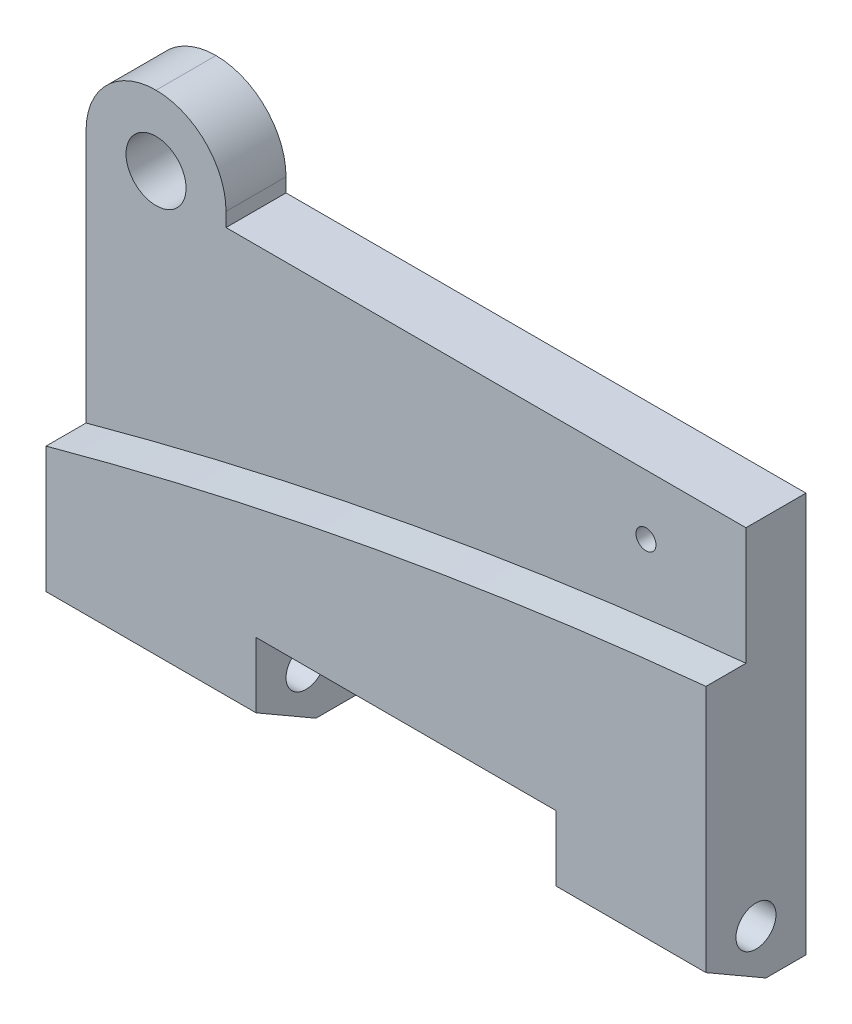
ISO-10303-21;
HEADER;
FILE_DESCRIPTION(('STEP AP214'),'2;1');
FILE_NAME('part.step','',(''),(''),'','','');
FILE_SCHEMA(('AUTOMOTIVE_DESIGN { 1 0 10303 214 1 1 1 1 }'));
ENDSEC;
DATA;
#1=APPLICATION_CONTEXT('core data for automotive mechanical design processes');
#2=APPLICATION_PROTOCOL_DEFINITION('international standard','automotive_design',2000,#1);
#3=PRODUCT_CONTEXT('',#1,'mechanical');
#4=PRODUCT('Part','Part','',(#3));
#5=PRODUCT_RELATED_PRODUCT_CATEGORY('part','',(#4));
#6=PRODUCT_DEFINITION_FORMATION('','',#4);
#7=PRODUCT_DEFINITION_CONTEXT('part definition',#1,'design');
#8=PRODUCT_DEFINITION('design','',#6,#7);
#9=PRODUCT_DEFINITION_SHAPE('','',#8);
#10=(LENGTH_UNIT() NAMED_UNIT(*) SI_UNIT(.MILLI.,.METRE.));
#11=(NAMED_UNIT(*) PLANE_ANGLE_UNIT() SI_UNIT($,.RADIAN.));
#12=(NAMED_UNIT(*) SI_UNIT($,.STERADIAN.) SOLID_ANGLE_UNIT());
#13=UNCERTAINTY_MEASURE_WITH_UNIT(LENGTH_MEASURE(1.E-05),#10,'distance_accuracy_value','');
#14=(GEOMETRIC_REPRESENTATION_CONTEXT(3) GLOBAL_UNCERTAINTY_ASSIGNED_CONTEXT((#13)) GLOBAL_UNIT_ASSIGNED_CONTEXT((#10,
#11,#12)) REPRESENTATION_CONTEXT('',''));
#15=CARTESIAN_POINT('',(0.,0.,0.));
#16=DIRECTION('',(0.,0.,1.));
#17=DIRECTION('',(1.,0.,0.));
#18=AXIS2_PLACEMENT_3D('',#15,#16,#17);
#19=CARTESIAN_POINT('',(-16.5,10.,5.));
#20=DIRECTION('',(0.,-1.,0.));
#21=DIRECTION('',(0.,0.,-1.));
#22=AXIS2_PLACEMENT_3D('',#19,#20,#21);
#23=PLANE('',#22);
#24=DIRECTION('',(0.,0.,-1.));
#25=VECTOR('',#24,1.);
#26=CARTESIAN_POINT('',(-9.5,10.,3.));
#27=LINE('',#26,#25);
#28=CARTESIAN_POINT('',(-9.5,10.,3.));
#29=VERTEX_POINT('',#28);
#30=CARTESIAN_POINT('',(-9.5,10.,0.));
#31=VERTEX_POINT('',#30);
#32=EDGE_CURVE('E152',#29,#31,#27,.T.);
#33=ORIENTED_EDGE('',*,*,#32,.F.);
#34=DIRECTION('',(-1.,0.,0.));
#35=VECTOR('',#34,1.);
#36=CARTESIAN_POINT('',(0.,10.,3.));
#37=LINE('',#36,#35);
#38=CARTESIAN_POINT('',(16.5,10.,3.));
#39=VERTEX_POINT('',#38);
#40=EDGE_CURVE('E189',#39,#29,#37,.T.);
#41=ORIENTED_EDGE('',*,*,#40,.F.);
#42=DIRECTION('',(0.,0.,-1.));
#43=VECTOR('',#42,1.);
#44=CARTESIAN_POINT('',(16.5,10.,5.));
#45=LINE('',#44,#43);
#46=CARTESIAN_POINT('',(16.5,10.,0.));
#47=VERTEX_POINT('',#46);
#48=EDGE_CURVE('E159',#39,#47,#45,.T.);
#49=ORIENTED_EDGE('',*,*,#48,.T.);
#50=DIRECTION('',(-1.,0.,0.));
#51=VECTOR('',#50,1.);
#52=CARTESIAN_POINT('',(-16.5,10.,0.));
#53=LINE('',#52,#51);
#54=EDGE_CURVE('E143',#47,#31,#53,.T.);
#55=ORIENTED_EDGE('',*,*,#54,.T.);
#56=EDGE_LOOP('',(#33,#41,#49,#55));
#57=FACE_BOUND('',#56,.T.);
#58=ADVANCED_FACE('F34',(#57),#23,.F.);
#59=CARTESIAN_POINT('',(16.5,-10.,5.));
#60=DIRECTION('',(-1.,0.,0.));
#61=DIRECTION('',(0.,0.,1.));
#62=AXIS2_PLACEMENT_3D('',#59,#60,#61);
#63=PLANE('',#62);
#64=CARTESIAN_POINT('',(16.5,-7.5,2.5));
#65=DIRECTION('',(1.,0.,0.));
#66=DIRECTION('',(0.,0.,-1.));
#67=AXIS2_PLACEMENT_3D('',#64,#65,#66);
#68=CIRCLE('',#67,1.);
#69=CARTESIAN_POINT('',(16.5,-7.5,1.5));
#70=VERTEX_POINT('',#69);
#71=EDGE_CURVE('E249',#70,#70,#68,.T.);
#72=ORIENTED_EDGE('',*,*,#71,.F.);
#73=EDGE_LOOP('',(#72));
#74=FACE_BOUND('',#73,.T.);
#75=DIRECTION('',(0.,1.,0.));
#76=VECTOR('',#75,1.);
#77=CARTESIAN_POINT('',(16.5,-10.,5.));
#78=LINE('',#77,#76);
#79=CARTESIAN_POINT('',(16.5,-8.26794919243112,5.));
#80=VERTEX_POINT('',#79);
#81=CARTESIAN_POINT('',(16.5,4.12898479637031,5.));
#82=VERTEX_POINT('',#81);
#83=EDGE_CURVE('E222',#80,#82,#78,.T.);
#84=ORIENTED_EDGE('',*,*,#83,.F.);
#85=DIRECTION('',(0.,0.499999999999997,0.86602540378444));
#86=VECTOR('',#85,1.);
#87=CARTESIAN_POINT('',(16.5,-8.26794919243112,5.));
#88=LINE('',#87,#86);
#89=CARTESIAN_POINT('',(16.5,-10.,1.99999999999998));
#90=VERTEX_POINT('',#89);
#91=EDGE_CURVE('E56',#80,#90,#88,.F.);
#92=ORIENTED_EDGE('',*,*,#91,.T.);
#93=DIRECTION('',(0.,0.,-1.));
#94=VECTOR('',#93,1.);
#95=CARTESIAN_POINT('',(16.5,-10.,5.));
#96=LINE('',#95,#94);
#97=CARTESIAN_POINT('',(16.5,-10.,0.));
#98=VERTEX_POINT('',#97);
#99=EDGE_CURVE('E216',#90,#98,#96,.T.);
#100=ORIENTED_EDGE('',*,*,#99,.T.);
#101=DIRECTION('',(0.,1.,0.));
#102=VECTOR('',#101,1.);
#103=CARTESIAN_POINT('',(16.5,-10.,0.));
#104=LINE('',#103,#102);
#105=EDGE_CURVE('E161',#98,#47,#104,.T.);
#106=ORIENTED_EDGE('',*,*,#105,.T.);
#107=ORIENTED_EDGE('',*,*,#48,.F.);
#108=DIRECTION('',(0.,1.,0.));
#109=VECTOR('',#108,1.);
#110=CARTESIAN_POINT('',(16.5,0.,3.));
#111=LINE('',#110,#109);
#112=CARTESIAN_POINT('',(16.5,4.12898479637031,3.));
#113=VERTEX_POINT('',#112);
#114=EDGE_CURVE('E186',#113,#39,#111,.T.);
#115=ORIENTED_EDGE('',*,*,#114,.F.);
#116=DIRECTION('',(0.,0.,1.));
#117=VECTOR('',#116,1.);
#118=CARTESIAN_POINT('',(16.5,4.12898479637031,3.));
#119=LINE('',#118,#117);
#120=EDGE_CURVE('E255',#113,#82,#119,.T.);
#121=ORIENTED_EDGE('',*,*,#120,.T.);
#122=EDGE_LOOP('',(#84,#92,#100,#106,#107,#115,#121));
#123=FACE_BOUND('',#122,.T.);
#124=ADVANCED_FACE('F315',(#74,#123),#63,.F.);
#125=CARTESIAN_POINT('',(-16.5,-10.,5.));
#126=DIRECTION('',(1.,0.,0.));
#127=DIRECTION('',(0.,0.,-1.));
#128=AXIS2_PLACEMENT_3D('',#125,#126,#127);
#129=PLANE('',#128);
#130=CARTESIAN_POINT('',(-16.5,-7.5,2.5));
#131=DIRECTION('',(1.,0.,0.));
#132=DIRECTION('',(0.,0.,-1.));
#133=AXIS2_PLACEMENT_3D('',#130,#131,#132);
#134=CIRCLE('',#133,1.);
#135=CARTESIAN_POINT('',(-16.5,-7.5,1.5));
#136=VERTEX_POINT('',#135);
#137=EDGE_CURVE('E201',#136,#136,#134,.T.);
#138=ORIENTED_EDGE('',*,*,#137,.T.);
#139=EDGE_LOOP('',(#138));
#140=FACE_BOUND('',#139,.T.);
#141=DIRECTION('',(0.,0.,-1.));
#142=VECTOR('',#141,1.);
#143=CARTESIAN_POINT('',(-16.5,-10.,5.));
#144=LINE('',#143,#142);
#145=CARTESIAN_POINT('',(-16.5,-10.,1.99999999999998));
#146=VERTEX_POINT('',#145);
#147=CARTESIAN_POINT('',(-16.5,-10.,0.));
#148=VERTEX_POINT('',#147);
#149=EDGE_CURVE('E204',#146,#148,#144,.T.);
#150=ORIENTED_EDGE('',*,*,#149,.F.);
#151=DIRECTION('',(0.,-0.499999999999997,-0.86602540378444));
#152=VECTOR('',#151,1.);
#153=CARTESIAN_POINT('',(-16.5,-8.26794919243112,5.));
#154=LINE('',#153,#152);
#155=CARTESIAN_POINT('',(-16.5,-8.26794919243112,5.));
#156=VERTEX_POINT('',#155);
#157=EDGE_CURVE('E273',#146,#156,#154,.F.);
#158=ORIENTED_EDGE('',*,*,#157,.T.);
#159=DIRECTION('',(0.,-1.,0.));
#160=VECTOR('',#159,1.);
#161=CARTESIAN_POINT('',(-16.5,-10.,5.));
#162=LINE('',#161,#160);
#163=CARTESIAN_POINT('',(-16.5,-1.96376903374117,5.));
#164=VERTEX_POINT('',#163);
#165=EDGE_CURVE('E243',#164,#156,#162,.T.);
#166=ORIENTED_EDGE('',*,*,#165,.F.);
#167=DIRECTION('',(0.,0.,1.));
#168=VECTOR('',#167,1.);
#169=CARTESIAN_POINT('',(-16.5,-1.96376903374117,3.));
#170=LINE('',#169,#168);
#171=CARTESIAN_POINT('',(-16.5,-1.96376903374117,3.));
#172=VERTEX_POINT('',#171);
#173=EDGE_CURVE('E252',#172,#164,#170,.T.);
#174=ORIENTED_EDGE('',*,*,#173,.F.);
#175=DIRECTION('',(0.,-1.,0.));
#176=VECTOR('',#175,1.);
#177=CARTESIAN_POINT('',(-16.5,0.,3.));
#178=LINE('',#177,#176);
#179=CARTESIAN_POINT('',(-16.5,10.7,3.));
#180=VERTEX_POINT('',#179);
#181=EDGE_CURVE('E192',#180,#172,#178,.T.);
#182=ORIENTED_EDGE('',*,*,#181,.F.);
#183=DIRECTION('',(0.,0.,1.));
#184=VECTOR('',#183,1.);
#185=CARTESIAN_POINT('',(-16.5,10.7,5.));
#186=LINE('',#185,#184);
#187=CARTESIAN_POINT('',(-16.5,10.7,0.));
#188=VERTEX_POINT('',#187);
#189=EDGE_CURVE('E287',#180,#188,#186,.F.);
#190=ORIENTED_EDGE('',*,*,#189,.T.);
#191=DIRECTION('',(0.,-1.,0.));
#192=VECTOR('',#191,1.);
#193=CARTESIAN_POINT('',(-16.5,-10.,0.));
#194=LINE('',#193,#192);
#195=EDGE_CURVE('E160',#188,#148,#194,.T.);
#196=ORIENTED_EDGE('',*,*,#195,.T.);
#197=EDGE_LOOP('',(#150,#158,#166,#174,#182,#190,#196));
#198=FACE_BOUND('',#197,.T.);
#199=ADVANCED_FACE('F270',(#140,#198),#129,.F.);
#200=CARTESIAN_POINT('',(0.,0.,5.));
#201=DIRECTION('',(0.,0.,-1.));
#202=DIRECTION('',(-1.,0.,0.));
#203=AXIS2_PLACEMENT_3D('',#200,#201,#202);
#204=PLANE('',#203);
#205=ORIENTED_EDGE('',*,*,#165,.T.);
#206=DIRECTION('',(1.,0.,0.));
#207=VECTOR('',#206,1.);
#208=CARTESIAN_POINT('',(0.,-8.26794919243112,5.));
#209=LINE('',#208,#207);
#210=CARTESIAN_POINT('',(-6.,-8.26794919243112,5.));
#211=VERTEX_POINT('',#210);
#212=EDGE_CURVE('E283',#156,#211,#209,.T.);
#213=ORIENTED_EDGE('',*,*,#212,.T.);
#214=DIRECTION('',(0.,1.,0.));
#215=VECTOR('',#214,1.);
#216=CARTESIAN_POINT('',(-6.,-10.,5.));
#217=LINE('',#216,#215);
#218=CARTESIAN_POINT('',(-6.,-5.,5.));
#219=VERTEX_POINT('',#218);
#220=EDGE_CURVE('E241',#211,#219,#217,.T.);
#221=ORIENTED_EDGE('',*,*,#220,.T.);
#222=DIRECTION('',(1.,0.,0.));
#223=VECTOR('',#222,1.);
#224=CARTESIAN_POINT('',(-6.,-5.,5.));
#225=LINE('',#224,#223);
#226=CARTESIAN_POINT('',(9.,-5.,5.));
#227=VERTEX_POINT('',#226);
#228=EDGE_CURVE('E239',#219,#227,#225,.T.);
#229=ORIENTED_EDGE('',*,*,#228,.T.);
#230=DIRECTION('',(0.,-1.,0.));
#231=VECTOR('',#230,1.);
#232=CARTESIAN_POINT('',(9.,-10.,5.));
#233=LINE('',#232,#231);
#234=CARTESIAN_POINT('',(9.,-8.26794919243112,5.));
#235=VERTEX_POINT('',#234);
#236=EDGE_CURVE('E218',#227,#235,#233,.T.);
#237=ORIENTED_EDGE('',*,*,#236,.T.);
#238=DIRECTION('',(1.,0.,0.));
#239=VECTOR('',#238,1.);
#240=CARTESIAN_POINT('',(0.,-8.26794919243112,5.));
#241=LINE('',#240,#239);
#242=EDGE_CURVE('E285',#235,#80,#241,.T.);
#243=ORIENTED_EDGE('',*,*,#242,.T.);
#244=ORIENTED_EDGE('',*,*,#83,.T.);
#245=CARTESIAN_POINT('',(35.7914299403676,-192.7734416106,5.));
#246=DIRECTION('',(0.,0.,1.));
#247=DIRECTION('',(1.,0.,0.));
#248=AXIS2_PLACEMENT_3D('',#245,#246,#247);
#249=CIRCLE('',#248,197.845204122052);
#250=EDGE_CURVE('E187',#82,#164,#249,.T.);
#251=ORIENTED_EDGE('',*,*,#250,.T.);
#252=EDGE_LOOP('',(#205,#213,#221,#229,#237,#243,#244,#251));
#253=FACE_BOUND('',#252,.T.);
#254=ADVANCED_FACE('F262',(#253),#204,.F.);
#255=CARTESIAN_POINT('',(-16.5,-10.,5.));
#256=DIRECTION('',(0.,1.,0.));
#257=DIRECTION('',(0.,0.,1.));
#258=AXIS2_PLACEMENT_3D('',#255,#256,#257);
#259=PLANE('',#258);
#260=DIRECTION('',(0.,0.,-1.));
#261=VECTOR('',#260,1.);
#262=CARTESIAN_POINT('',(-6.,-10.,5.));
#263=LINE('',#262,#261);
#264=CARTESIAN_POINT('',(-6.,-10.,1.99999999999998));
#265=VERTEX_POINT('',#264);
#266=CARTESIAN_POINT('',(-6.,-10.,0.));
#267=VERTEX_POINT('',#266);
#268=EDGE_CURVE('E206',#265,#267,#263,.T.);
#269=ORIENTED_EDGE('',*,*,#268,.F.);
#270=DIRECTION('',(-1.,0.,0.));
#271=VECTOR('',#270,1.);
#272=CARTESIAN_POINT('',(-16.5,-10.,1.99999999999998));
#273=LINE('',#272,#271);
#274=EDGE_CURVE('E276',#265,#146,#273,.T.);
#275=ORIENTED_EDGE('',*,*,#274,.T.);
#276=ORIENTED_EDGE('',*,*,#149,.T.);
#277=DIRECTION('',(1.,0.,0.));
#278=VECTOR('',#277,1.);
#279=CARTESIAN_POINT('',(-16.5,-10.,0.));
#280=LINE('',#279,#278);
#281=EDGE_CURVE('E230',#148,#267,#280,.T.);
#282=ORIENTED_EDGE('',*,*,#281,.T.);
#283=EDGE_LOOP('',(#269,#275,#276,#282));
#284=FACE_BOUND('',#283,.T.);
#285=ADVANCED_FACE('F335',(#284),#259,.F.);
#286=CARTESIAN_POINT('',(-6.,-10.,5.));
#287=DIRECTION('',(-1.,0.,0.));
#288=DIRECTION('',(0.,0.,1.));
#289=AXIS2_PLACEMENT_3D('',#286,#287,#288);
#290=PLANE('',#289);
#291=CARTESIAN_POINT('',(-6.,-7.5,2.5));
#292=DIRECTION('',(-1.,0.,0.));
#293=DIRECTION('',(0.,0.,1.));
#294=AXIS2_PLACEMENT_3D('',#291,#292,#293);
#295=CIRCLE('',#294,1.);
#296=CARTESIAN_POINT('',(-6.,-7.5,3.5));
#297=VERTEX_POINT('',#296);
#298=EDGE_CURVE('E200',#297,#297,#295,.T.);
#299=ORIENTED_EDGE('',*,*,#298,.T.);
#300=EDGE_LOOP('',(#299));
#301=FACE_BOUND('',#300,.T.);
#302=ORIENTED_EDGE('',*,*,#220,.F.);
#303=DIRECTION('',(0.,0.499999999999997,0.86602540378444));
#304=VECTOR('',#303,1.);
#305=CARTESIAN_POINT('',(-6.,-8.26794919243112,5.));
#306=LINE('',#305,#304);
#307=EDGE_CURVE('E279',#211,#265,#306,.F.);
#308=ORIENTED_EDGE('',*,*,#307,.T.);
#309=ORIENTED_EDGE('',*,*,#268,.T.);
#310=DIRECTION('',(0.,1.,0.));
#311=VECTOR('',#310,1.);
#312=CARTESIAN_POINT('',(-6.,-10.,0.));
#313=LINE('',#312,#311);
#314=CARTESIAN_POINT('',(-6.,-5.,0.));
#315=VERTEX_POINT('',#314);
#316=EDGE_CURVE('E228',#267,#315,#313,.T.);
#317=ORIENTED_EDGE('',*,*,#316,.T.);
#318=DIRECTION('',(0.,0.,-1.));
#319=VECTOR('',#318,1.);
#320=CARTESIAN_POINT('',(-6.,-5.,5.));
#321=LINE('',#320,#319);
#322=EDGE_CURVE('E208',#219,#315,#321,.T.);
#323=ORIENTED_EDGE('',*,*,#322,.F.);
#324=EDGE_LOOP('',(#302,#308,#309,#317,#323));
#325=FACE_BOUND('',#324,.T.);
#326=ADVANCED_FACE('F332',(#301,#325),#290,.F.);
#327=CARTESIAN_POINT('',(-6.,-5.,5.));
#328=DIRECTION('',(0.,1.,0.));
#329=DIRECTION('',(0.,0.,1.));
#330=AXIS2_PLACEMENT_3D('',#327,#328,#329);
#331=PLANE('',#330);
#332=DIRECTION('',(1.,0.,0.));
#333=VECTOR('',#332,1.);
#334=CARTESIAN_POINT('',(-6.,-5.,0.));
#335=LINE('',#334,#333);
#336=CARTESIAN_POINT('',(9.,-5.,0.));
#337=VERTEX_POINT('',#336);
#338=EDGE_CURVE('E226',#315,#337,#335,.T.);
#339=ORIENTED_EDGE('',*,*,#338,.T.);
#340=DIRECTION('',(0.,0.,-1.));
#341=VECTOR('',#340,1.);
#342=CARTESIAN_POINT('',(9.,-5.,5.));
#343=LINE('',#342,#341);
#344=EDGE_CURVE('E211',#227,#337,#343,.T.);
#345=ORIENTED_EDGE('',*,*,#344,.F.);
#346=ORIENTED_EDGE('',*,*,#228,.F.);
#347=ORIENTED_EDGE('',*,*,#322,.T.);
#348=EDGE_LOOP('',(#339,#345,#346,#347));
#349=FACE_BOUND('',#348,.T.);
#350=ADVANCED_FACE('F327',(#349),#331,.F.);
#351=CARTESIAN_POINT('',(9.,-10.,5.));
#352=DIRECTION('',(1.,0.,0.));
#353=DIRECTION('',(0.,0.,-1.));
#354=AXIS2_PLACEMENT_3D('',#351,#352,#353);
#355=PLANE('',#354);
#356=CARTESIAN_POINT('',(9.,-7.5,2.5));
#357=DIRECTION('',(1.,0.,0.));
#358=DIRECTION('',(0.,0.,-1.));
#359=AXIS2_PLACEMENT_3D('',#356,#357,#358);
#360=CIRCLE('',#359,1.);
#361=CARTESIAN_POINT('',(9.,-7.5,1.5));
#362=VERTEX_POINT('',#361);
#363=EDGE_CURVE('E197',#362,#362,#360,.T.);
#364=ORIENTED_EDGE('',*,*,#363,.T.);
#365=EDGE_LOOP('',(#364));
#366=FACE_BOUND('',#365,.T.);
#367=DIRECTION('',(0.,0.,-1.));
#368=VECTOR('',#367,1.);
#369=CARTESIAN_POINT('',(9.,-10.,5.));
#370=LINE('',#369,#368);
#371=CARTESIAN_POINT('',(9.,-10.,1.99999999999998));
#372=VERTEX_POINT('',#371);
#373=CARTESIAN_POINT('',(9.,-10.,0.));
#374=VERTEX_POINT('',#373);
#375=EDGE_CURVE('E214',#372,#374,#370,.T.);
#376=ORIENTED_EDGE('',*,*,#375,.F.);
#377=DIRECTION('',(0.,-0.499999999999997,-0.86602540378444));
#378=VECTOR('',#377,1.);
#379=CARTESIAN_POINT('',(9.,-8.26794919243112,5.));
#380=LINE('',#379,#378);
#381=EDGE_CURVE('E12',#372,#235,#380,.F.);
#382=ORIENTED_EDGE('',*,*,#381,.T.);
#383=ORIENTED_EDGE('',*,*,#236,.F.);
#384=ORIENTED_EDGE('',*,*,#344,.T.);
#385=DIRECTION('',(0.,-1.,0.));
#386=VECTOR('',#385,1.);
#387=CARTESIAN_POINT('',(9.,-10.,0.));
#388=LINE('',#387,#386);
#389=EDGE_CURVE('E223',#337,#374,#388,.T.);
#390=ORIENTED_EDGE('',*,*,#389,.T.);
#391=EDGE_LOOP('',(#376,#382,#383,#384,#390));
#392=FACE_BOUND('',#391,.T.);
#393=ADVANCED_FACE('F322',(#366,#392),#355,.F.);
#394=CARTESIAN_POINT('',(9.,-10.,5.));
#395=DIRECTION('',(0.,1.,0.));
#396=DIRECTION('',(0.,0.,1.));
#397=AXIS2_PLACEMENT_3D('',#394,#395,#396);
#398=PLANE('',#397);
#399=ORIENTED_EDGE('',*,*,#99,.F.);
#400=DIRECTION('',(-1.,0.,0.));
#401=VECTOR('',#400,1.);
#402=CARTESIAN_POINT('',(9.,-10.,1.99999999999998));
#403=LINE('',#402,#401);
#404=EDGE_CURVE('E42',#90,#372,#403,.T.);
#405=ORIENTED_EDGE('',*,*,#404,.T.);
#406=ORIENTED_EDGE('',*,*,#375,.T.);
#407=DIRECTION('',(1.,0.,0.));
#408=VECTOR('',#407,1.);
#409=CARTESIAN_POINT('',(9.,-10.,0.));
#410=LINE('',#409,#408);
#411=EDGE_CURVE('E219',#374,#98,#410,.T.);
#412=ORIENTED_EDGE('',*,*,#411,.T.);
#413=EDGE_LOOP('',(#399,#405,#406,#412));
#414=FACE_BOUND('',#413,.T.);
#415=ADVANCED_FACE('F319',(#414),#398,.F.);
#416=CARTESIAN_POINT('',(0.,0.,0.));
#417=DIRECTION('',(0.,0.,-1.));
#418=DIRECTION('',(-1.,0.,0.));
#419=AXIS2_PLACEMENT_3D('',#416,#417,#418);
#420=PLANE('',#419);
#421=CARTESIAN_POINT('',(-13.,10.7,0.));
#422=DIRECTION('',(0.,0.,-1.));
#423=DIRECTION('',(-1.,0.,0.));
#424=AXIS2_PLACEMENT_3D('',#421,#422,#423);
#425=CIRCLE('',#424,1.5);
#426=CARTESIAN_POINT('',(-14.5,10.7,0.));
#427=VERTEX_POINT('',#426);
#428=EDGE_CURVE('E168',#427,#427,#425,.T.);
#429=ORIENTED_EDGE('',*,*,#428,.F.);
#430=EDGE_LOOP('',(#429));
#431=FACE_BOUND('',#430,.T.);
#432=CARTESIAN_POINT('',(11.5,7.00000000000001,0.));
#433=DIRECTION('',(0.,0.,-1.));
#434=DIRECTION('',(1.,0.,0.));
#435=AXIS2_PLACEMENT_3D('',#432,#433,#434);
#436=CIRCLE('',#435,0.500000000000001);
#437=CARTESIAN_POINT('',(12.,7.00000000000001,0.));
#438=VERTEX_POINT('',#437);
#439=EDGE_CURVE('E179',#438,#438,#436,.T.);
#440=ORIENTED_EDGE('',*,*,#439,.F.);
#441=EDGE_LOOP('',(#440));
#442=FACE_BOUND('',#441,.T.);
#443=CARTESIAN_POINT('',(-13.,10.7,0.));
#444=DIRECTION('',(0.,0.,-1.));
#445=DIRECTION('',(-1.,0.,0.));
#446=AXIS2_PLACEMENT_3D('',#443,#444,#445);
#447=CIRCLE('',#446,3.5);
#448=CARTESIAN_POINT('',(-13.,14.2,0.));
#449=VERTEX_POINT('',#448);
#450=EDGE_CURVE('E203',#188,#449,#447,.T.);
#451=ORIENTED_EDGE('',*,*,#450,.T.);
#452=CARTESIAN_POINT('',(-13.,10.7,0.));
#453=DIRECTION('',(0.,0.,-1.));
#454=DIRECTION('',(-1.,0.,0.));
#455=AXIS2_PLACEMENT_3D('',#452,#453,#454);
#456=CIRCLE('',#455,3.5);
#457=CARTESIAN_POINT('',(-9.5,10.7,0.));
#458=VERTEX_POINT('',#457);
#459=EDGE_CURVE('E146',#449,#458,#456,.T.);
#460=ORIENTED_EDGE('',*,*,#459,.T.);
#461=DIRECTION('',(0.,-1.,0.));
#462=VECTOR('',#461,1.);
#463=CARTESIAN_POINT('',(-9.5,14.2,0.));
#464=LINE('',#463,#462);
#465=EDGE_CURVE('E139',#458,#31,#464,.T.);
#466=ORIENTED_EDGE('',*,*,#465,.T.);
#467=ORIENTED_EDGE('',*,*,#54,.F.);
#468=ORIENTED_EDGE('',*,*,#105,.F.);
#469=ORIENTED_EDGE('',*,*,#411,.F.);
#470=ORIENTED_EDGE('',*,*,#389,.F.);
#471=ORIENTED_EDGE('',*,*,#338,.F.);
#472=ORIENTED_EDGE('',*,*,#316,.F.);
#473=ORIENTED_EDGE('',*,*,#281,.F.);
#474=ORIENTED_EDGE('',*,*,#195,.F.);
#475=EDGE_LOOP('',(#451,#460,#466,#467,#468,#469,#470,#471,#472,#473,#474));
#476=FACE_BOUND('',#475,.T.);
#477=ADVANCED_FACE('F141',(#431,#442,#476),#420,.T.);
#478=CARTESIAN_POINT('',(-16.5,-7.5,2.5));
#479=DIRECTION('',(1.,0.,0.));
#480=DIRECTION('',(0.,0.,-1.));
#481=AXIS2_PLACEMENT_3D('',#478,#479,#480);
#482=CYLINDRICAL_SURFACE('',#481,1.);
#483=ORIENTED_EDGE('',*,*,#71,.T.);
#484=EDGE_LOOP('',(#483));
#485=FACE_BOUND('',#484,.T.);
#486=ORIENTED_EDGE('',*,*,#363,.F.);
#487=EDGE_LOOP('',(#486));
#488=FACE_BOUND('',#487,.T.);
#489=ADVANCED_FACE('F347',(#485,#488),#482,.F.);
#490=ORIENTED_EDGE('',*,*,#137,.F.);
#491=EDGE_LOOP('',(#490));
#492=FACE_BOUND('',#491,.T.);
#493=ORIENTED_EDGE('',*,*,#298,.F.);
#494=EDGE_LOOP('',(#493));
#495=FACE_BOUND('',#494,.T.);
#496=ADVANCED_FACE('F338',(#492,#495),#482,.F.);
#497=CARTESIAN_POINT('',(35.7914299403676,-192.7734416106,3.));
#498=DIRECTION('',(0.,0.,1.));
#499=DIRECTION('',(1.,0.,0.));
#500=AXIS2_PLACEMENT_3D('',#497,#498,#499);
#501=CYLINDRICAL_SURFACE('',#500,197.845204122052);
#502=ORIENTED_EDGE('',*,*,#250,.F.);
#503=ORIENTED_EDGE('',*,*,#120,.F.);
#504=CARTESIAN_POINT('',(35.7914299403676,-192.7734416106,3.));
#505=DIRECTION('',(0.,0.,1.));
#506=DIRECTION('',(1.,0.,0.));
#507=AXIS2_PLACEMENT_3D('',#504,#505,#506);
#508=CIRCLE('',#507,197.845204122052);
#509=EDGE_CURVE('E183',#113,#172,#508,.T.);
#510=ORIENTED_EDGE('',*,*,#509,.T.);
#511=ORIENTED_EDGE('',*,*,#173,.T.);
#512=EDGE_LOOP('',(#502,#503,#510,#511));
#513=FACE_BOUND('',#512,.T.);
#514=ADVANCED_FACE('F336',(#513),#501,.T.);
#515=CARTESIAN_POINT('',(0.,0.,3.));
#516=DIRECTION('',(0.,0.,1.));
#517=DIRECTION('',(1.,0.,0.));
#518=AXIS2_PLACEMENT_3D('',#515,#516,#517);
#519=PLANE('',#518);
#520=CARTESIAN_POINT('',(-13.,10.7,3.));
#521=DIRECTION('',(0.,0.,1.));
#522=DIRECTION('',(1.,0.,0.));
#523=AXIS2_PLACEMENT_3D('',#520,#521,#522);
#524=CIRCLE('',#523,1.5);
#525=CARTESIAN_POINT('',(-11.5,10.7,3.));
#526=VERTEX_POINT('',#525);
#527=EDGE_CURVE('E165',#526,#526,#524,.T.);
#528=ORIENTED_EDGE('',*,*,#527,.F.);
#529=EDGE_LOOP('',(#528));
#530=FACE_BOUND('',#529,.T.);
#531=CARTESIAN_POINT('',(11.5,7.00000000000001,3.));
#532=DIRECTION('',(0.,0.,1.));
#533=DIRECTION('',(1.,0.,0.));
#534=AXIS2_PLACEMENT_3D('',#531,#532,#533);
#535=CIRCLE('',#534,0.500000000000001);
#536=CARTESIAN_POINT('',(12.,7.00000000000001,3.));
#537=VERTEX_POINT('',#536);
#538=EDGE_CURVE('E182',#537,#537,#535,.T.);
#539=ORIENTED_EDGE('',*,*,#538,.F.);
#540=EDGE_LOOP('',(#539));
#541=FACE_BOUND('',#540,.T.);
#542=DIRECTION('',(0.,-1.,0.));
#543=VECTOR('',#542,1.);
#544=CARTESIAN_POINT('',(-9.5,14.2,3.));
#545=LINE('',#544,#543);
#546=CARTESIAN_POINT('',(-9.5,10.7,3.));
#547=VERTEX_POINT('',#546);
#548=EDGE_CURVE('E151',#547,#29,#545,.T.);
#549=ORIENTED_EDGE('',*,*,#548,.F.);
#550=CARTESIAN_POINT('',(-13.,10.7,3.));
#551=DIRECTION('',(0.,0.,1.));
#552=DIRECTION('',(1.,0.,0.));
#553=AXIS2_PLACEMENT_3D('',#550,#551,#552);
#554=CIRCLE('',#553,3.5);
#555=CARTESIAN_POINT('',(-13.,14.2,3.));
#556=VERTEX_POINT('',#555);
#557=EDGE_CURVE('E292',#547,#556,#554,.T.);
#558=ORIENTED_EDGE('',*,*,#557,.T.);
#559=CARTESIAN_POINT('',(-13.,10.7,3.));
#560=DIRECTION('',(0.,0.,1.));
#561=DIRECTION('',(1.,0.,0.));
#562=AXIS2_PLACEMENT_3D('',#559,#560,#561);
#563=CIRCLE('',#562,3.5);
#564=EDGE_CURVE('E294',#556,#180,#563,.T.);
#565=ORIENTED_EDGE('',*,*,#564,.T.);
#566=ORIENTED_EDGE('',*,*,#181,.T.);
#567=ORIENTED_EDGE('',*,*,#509,.F.);
#568=ORIENTED_EDGE('',*,*,#114,.T.);
#569=ORIENTED_EDGE('',*,*,#40,.T.);
#570=EDGE_LOOP('',(#549,#558,#565,#566,#567,#568,#569));
#571=FACE_BOUND('',#570,.T.);
#572=ADVANCED_FACE('F312',(#530,#541,#571),#519,.T.);
#573=CARTESIAN_POINT('',(11.5,7.00000000000001,5.));
#574=DIRECTION('',(0.,0.,-1.));
#575=DIRECTION('',(-1.,0.,0.));
#576=AXIS2_PLACEMENT_3D('',#573,#574,#575);
#577=CYLINDRICAL_SURFACE('',#576,0.500000000000001);
#578=ORIENTED_EDGE('',*,*,#538,.T.);
#579=EDGE_LOOP('',(#578));
#580=FACE_BOUND('',#579,.T.);
#581=ORIENTED_EDGE('',*,*,#439,.T.);
#582=EDGE_LOOP('',(#581));
#583=FACE_BOUND('',#582,.T.);
#584=ADVANCED_FACE('F344',(#580,#583),#577,.F.);
#585=CARTESIAN_POINT('',(-9.5,14.2,3.));
#586=DIRECTION('',(-1.,0.,0.));
#587=DIRECTION('',(0.,0.,1.));
#588=AXIS2_PLACEMENT_3D('',#585,#586,#587);
#589=PLANE('',#588);
#590=ORIENTED_EDGE('',*,*,#465,.F.);
#591=DIRECTION('',(0.,0.,-1.));
#592=VECTOR('',#591,1.);
#593=CARTESIAN_POINT('',(-9.5,10.7,3.));
#594=LINE('',#593,#592);
#595=EDGE_CURVE('E296',#458,#547,#594,.F.);
#596=ORIENTED_EDGE('',*,*,#595,.T.);
#597=ORIENTED_EDGE('',*,*,#548,.T.);
#598=ORIENTED_EDGE('',*,*,#32,.T.);
#599=EDGE_LOOP('',(#590,#596,#597,#598));
#600=FACE_BOUND('',#599,.T.);
#601=ADVANCED_FACE('F163',(#600),#589,.F.);
#602=CARTESIAN_POINT('',(-13.,10.7,5.));
#603=DIRECTION('',(0.,0.,-1.));
#604=DIRECTION('',(-1.,0.,0.));
#605=AXIS2_PLACEMENT_3D('',#602,#603,#604);
#606=CYLINDRICAL_SURFACE('',#605,1.5);
#607=ORIENTED_EDGE('',*,*,#527,.T.);
#608=EDGE_LOOP('',(#607));
#609=FACE_BOUND('',#608,.T.);
#610=ORIENTED_EDGE('',*,*,#428,.T.);
#611=EDGE_LOOP('',(#610));
#612=FACE_BOUND('',#611,.T.);
#613=ADVANCED_FACE('F364',(#609,#612),#606,.F.);
#614=CARTESIAN_POINT('',(-13.,10.7,0.));
#615=DIRECTION('',(0.,0.,1.));
#616=DIRECTION('',(1.,0.,0.));
#617=AXIS2_PLACEMENT_3D('',#614,#615,#616);
#618=CYLINDRICAL_SURFACE('',#617,3.5);
#619=ORIENTED_EDGE('',*,*,#189,.F.);
#620=ORIENTED_EDGE('',*,*,#564,.F.);
#621=DIRECTION('',(0.,0.,1.));
#622=VECTOR('',#621,1.);
#623=CARTESIAN_POINT('',(-13.,14.2,0.));
#624=LINE('',#623,#622);
#625=EDGE_CURVE('E288',#449,#556,#624,.T.);
#626=ORIENTED_EDGE('',*,*,#625,.F.);
#627=ORIENTED_EDGE('',*,*,#450,.F.);
#628=EDGE_LOOP('',(#619,#620,#626,#627));
#629=FACE_BOUND('',#628,.T.);
#630=ADVANCED_FACE('F308',(#629),#618,.T.);
#631=CARTESIAN_POINT('',(-13.,10.7,0.));
#632=DIRECTION('',(0.,0.,-1.));
#633=DIRECTION('',(-1.,0.,0.));
#634=AXIS2_PLACEMENT_3D('',#631,#632,#633);
#635=CYLINDRICAL_SURFACE('',#634,3.5);
#636=ORIENTED_EDGE('',*,*,#557,.F.);
#637=ORIENTED_EDGE('',*,*,#595,.F.);
#638=ORIENTED_EDGE('',*,*,#459,.F.);
#639=ORIENTED_EDGE('',*,*,#625,.T.);
#640=EDGE_LOOP('',(#636,#637,#638,#639));
#641=FACE_BOUND('',#640,.T.);
#642=ADVANCED_FACE('F310',(#641),#635,.T.);
#643=CARTESIAN_POINT('',(0.,-8.26794919243112,5.));
#644=DIRECTION('',(0.,0.86602540378444,-0.499999999999997));
#645=DIRECTION('',(1.,0.,0.));
#646=AXIS2_PLACEMENT_3D('',#643,#644,#645);
#647=PLANE('',#646);
#648=ORIENTED_EDGE('',*,*,#157,.F.);
#649=ORIENTED_EDGE('',*,*,#274,.F.);
#650=ORIENTED_EDGE('',*,*,#307,.F.);
#651=ORIENTED_EDGE('',*,*,#212,.F.);
#652=EDGE_LOOP('',(#648,#649,#650,#651));
#653=FACE_BOUND('',#652,.T.);
#654=ADVANCED_FACE('F362',(#653),#647,.F.);
#655=CARTESIAN_POINT('',(0.,-8.26794919243112,5.));
#656=DIRECTION('',(0.,0.86602540378444,-0.499999999999997));
#657=DIRECTION('',(1.,0.,0.));
#658=AXIS2_PLACEMENT_3D('',#655,#656,#657);
#659=PLANE('',#658);
#660=ORIENTED_EDGE('',*,*,#381,.F.);
#661=ORIENTED_EDGE('',*,*,#404,.F.);
#662=ORIENTED_EDGE('',*,*,#91,.F.);
#663=ORIENTED_EDGE('',*,*,#242,.F.);
#664=EDGE_LOOP('',(#660,#661,#662,#663));
#665=FACE_BOUND('',#664,.T.);
#666=ADVANCED_FACE('F36',(#665),#659,.F.);
#667=CLOSED_SHELL('',(#58,#124,#199,#254,#285,#326,#350,#393,#415,#477,#489,#496,#514,#572,#584,
#601,#613,#630,#642,#654,#666));
#668=MANIFOLD_SOLID_BREP('B2',#667);
#669=ADVANCED_BREP_SHAPE_REPRESENTATION('',(#18,#668),#14);
#670=SHAPE_DEFINITION_REPRESENTATION(#9,#669);
ENDSEC;
END-ISO-10303-21;
